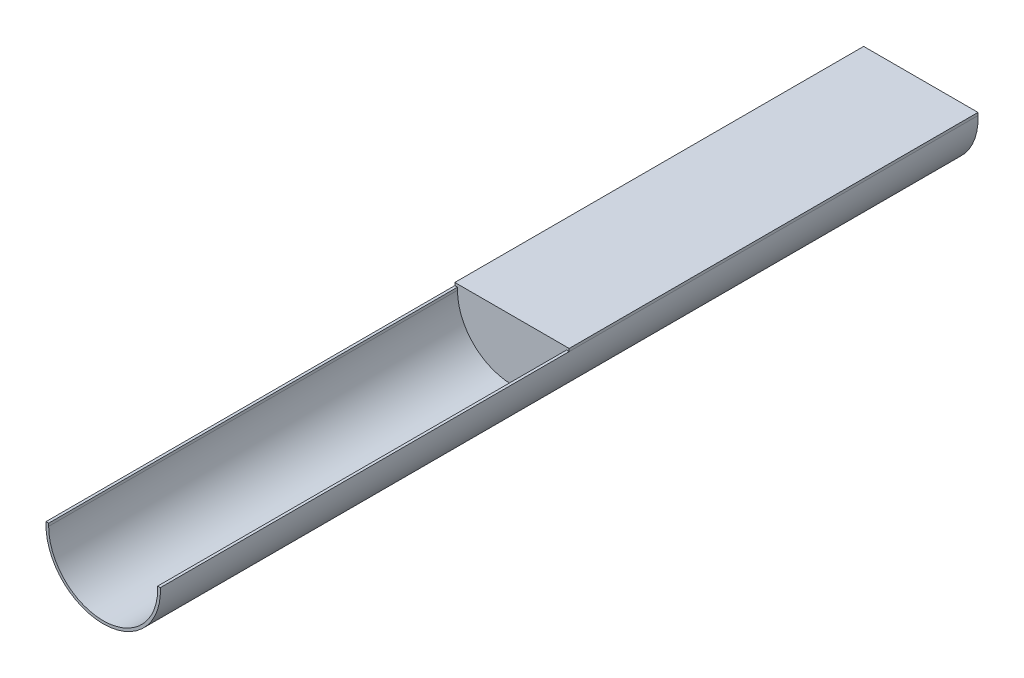
ISO-10303-21;
HEADER;
FILE_DESCRIPTION(('STEP AP214'),'2;1');
FILE_NAME('part.step','',(''),(''),'','','');
FILE_SCHEMA(('AUTOMOTIVE_DESIGN { 1 0 10303 214 1 1 1 1 }'));
ENDSEC;
DATA;
#1=APPLICATION_CONTEXT('core data for automotive mechanical design processes');
#2=APPLICATION_PROTOCOL_DEFINITION('international standard','automotive_design',2000,#1);
#3=PRODUCT_CONTEXT('',#1,'mechanical');
#4=PRODUCT('Part','Part','',(#3));
#5=PRODUCT_RELATED_PRODUCT_CATEGORY('part','',(#4));
#6=PRODUCT_DEFINITION_FORMATION('','',#4);
#7=PRODUCT_DEFINITION_CONTEXT('part definition',#1,'design');
#8=PRODUCT_DEFINITION('design','',#6,#7);
#9=PRODUCT_DEFINITION_SHAPE('','',#8);
#10=(LENGTH_UNIT() NAMED_UNIT(*) SI_UNIT(.MILLI.,.METRE.));
#11=(NAMED_UNIT(*) PLANE_ANGLE_UNIT() SI_UNIT($,.RADIAN.));
#12=(NAMED_UNIT(*) SI_UNIT($,.STERADIAN.) SOLID_ANGLE_UNIT());
#13=UNCERTAINTY_MEASURE_WITH_UNIT(LENGTH_MEASURE(1.E-05),#10,'distance_accuracy_value','');
#14=(GEOMETRIC_REPRESENTATION_CONTEXT(3) GLOBAL_UNCERTAINTY_ASSIGNED_CONTEXT((#13)) GLOBAL_UNIT_ASSIGNED_CONTEXT((#10,
#11,#12)) REPRESENTATION_CONTEXT('',''));
#15=CARTESIAN_POINT('',(0.,0.,0.));
#16=DIRECTION('',(0.,0.,1.));
#17=DIRECTION('',(1.,0.,0.));
#18=AXIS2_PLACEMENT_3D('',#15,#16,#17);
#19=CARTESIAN_POINT('',(40.,0.,600.));
#20=DIRECTION('',(1.,0.,0.));
#21=DIRECTION('',(0.,0.,-1.));
#22=AXIS2_PLACEMENT_3D('',#19,#20,#21);
#23=PLANE('',#22);
#24=DIRECTION('',(0.,1.,0.));
#25=VECTOR('',#24,1.);
#26=CARTESIAN_POINT('',(40.,0.,300.));
#27=LINE('',#26,#25);
#28=CARTESIAN_POINT('',(40.,0.,300.));
#29=VERTEX_POINT('',#28);
#30=CARTESIAN_POINT('',(40.,2.,300.));
#31=VERTEX_POINT('',#30);
#32=EDGE_CURVE('E218',#29,#31,#27,.T.);
#33=ORIENTED_EDGE('',*,*,#32,.F.);
#34=DIRECTION('',(0.,0.,-1.));
#35=VECTOR('',#34,1.);
#36=CARTESIAN_POINT('',(40.,0.,600.));
#37=LINE('',#36,#35);
#38=CARTESIAN_POINT('',(40.,0.,600.));
#39=VERTEX_POINT('',#38);
#40=EDGE_CURVE('E210',#39,#29,#37,.T.);
#41=ORIENTED_EDGE('',*,*,#40,.F.);
#42=DIRECTION('',(0.,-1.,0.));
#43=VECTOR('',#42,1.);
#44=CARTESIAN_POINT('',(40.,0.,600.));
#45=LINE('',#44,#43);
#46=CARTESIAN_POINT('',(40.,2.,600.));
#47=VERTEX_POINT('',#46);
#48=EDGE_CURVE('E191',#47,#39,#45,.T.);
#49=ORIENTED_EDGE('',*,*,#48,.F.);
#50=DIRECTION('',(0.,0.,-1.));
#51=VECTOR('',#50,1.);
#52=CARTESIAN_POINT('',(40.,2.,600.));
#53=LINE('',#52,#51);
#54=EDGE_CURVE('E41',#47,#31,#53,.T.);
#55=ORIENTED_EDGE('',*,*,#54,.T.);
#56=EDGE_LOOP('',(#33,#41,#49,#55));
#57=FACE_BOUND('',#56,.T.);
#58=ADVANCED_FACE('F33',(#57),#23,.F.);
#59=CARTESIAN_POINT('',(0.,0.,600.));
#60=DIRECTION('',(0.,0.,-1.));
#61=DIRECTION('',(-1.,0.,0.));
#62=AXIS2_PLACEMENT_3D('',#59,#60,#61);
#63=CYLINDRICAL_SURFACE('',#62,40.);
#64=CARTESIAN_POINT('',(0.,0.,300.));
#65=DIRECTION('',(0.,0.,-1.));
#66=DIRECTION('',(-1.,0.,0.));
#67=AXIS2_PLACEMENT_3D('',#64,#65,#66);
#68=CIRCLE('',#67,40.);
#69=CARTESIAN_POINT('',(-40.,0.,300.));
#70=VERTEX_POINT('',#69);
#71=EDGE_CURVE('E139',#70,#29,#68,.F.);
#72=ORIENTED_EDGE('',*,*,#71,.F.);
#73=DIRECTION('',(0.,0.,-1.));
#74=VECTOR('',#73,1.);
#75=CARTESIAN_POINT('',(-40.,0.,600.));
#76=LINE('',#75,#74);
#77=CARTESIAN_POINT('',(-40.,0.,600.));
#78=VERTEX_POINT('',#77);
#79=EDGE_CURVE('E135',#78,#70,#76,.T.);
#80=ORIENTED_EDGE('',*,*,#79,.F.);
#81=CARTESIAN_POINT('',(0.,0.,600.));
#82=DIRECTION('',(0.,0.,-1.));
#83=DIRECTION('',(1.,0.,0.));
#84=AXIS2_PLACEMENT_3D('',#81,#82,#83);
#85=CIRCLE('',#84,40.);
#86=EDGE_CURVE('E193',#39,#78,#85,.T.);
#87=ORIENTED_EDGE('',*,*,#86,.F.);
#88=ORIENTED_EDGE('',*,*,#40,.T.);
#89=EDGE_LOOP('',(#72,#80,#87,#88));
#90=FACE_BOUND('',#89,.T.);
#91=ADVANCED_FACE('F274',(#90),#63,.F.);
#92=CARTESIAN_POINT('',(-40.,0.,600.));
#93=DIRECTION('',(-1.,0.,0.));
#94=DIRECTION('',(0.,0.,1.));
#95=AXIS2_PLACEMENT_3D('',#92,#93,#94);
#96=PLANE('',#95);
#97=DIRECTION('',(0.,-1.,0.));
#98=VECTOR('',#97,1.);
#99=CARTESIAN_POINT('',(-40.,0.,300.));
#100=LINE('',#99,#98);
#101=CARTESIAN_POINT('',(-40.,2.,300.));
#102=VERTEX_POINT('',#101);
#103=EDGE_CURVE('E128',#102,#70,#100,.T.);
#104=ORIENTED_EDGE('',*,*,#103,.F.);
#105=DIRECTION('',(0.,0.,-1.));
#106=VECTOR('',#105,1.);
#107=CARTESIAN_POINT('',(-40.,2.,600.));
#108=LINE('',#107,#106);
#109=CARTESIAN_POINT('',(-40.,2.,600.));
#110=VERTEX_POINT('',#109);
#111=EDGE_CURVE('E132',#110,#102,#108,.T.);
#112=ORIENTED_EDGE('',*,*,#111,.F.);
#113=DIRECTION('',(0.,1.,0.));
#114=VECTOR('',#113,1.);
#115=CARTESIAN_POINT('',(-40.,0.,600.));
#116=LINE('',#115,#114);
#117=EDGE_CURVE('E195',#78,#110,#116,.T.);
#118=ORIENTED_EDGE('',*,*,#117,.F.);
#119=ORIENTED_EDGE('',*,*,#79,.T.);
#120=EDGE_LOOP('',(#104,#112,#118,#119));
#121=FACE_BOUND('',#120,.T.);
#122=ADVANCED_FACE('F130',(#121),#96,.F.);
#123=CARTESIAN_POINT('',(41.9523539268061,2.,600.));
#124=DIRECTION('',(0.,-1.,0.));
#125=DIRECTION('',(0.,0.,-1.));
#126=AXIS2_PLACEMENT_3D('',#123,#124,#125);
#127=PLANE('',#126);
#128=DIRECTION('',(1.,0.,0.));
#129=VECTOR('',#128,1.);
#130=CARTESIAN_POINT('',(-41.952353926806,2.,300.));
#131=LINE('',#130,#129);
#132=CARTESIAN_POINT('',(41.9523539268061,2.,300.));
#133=VERTEX_POINT('',#132);
#134=EDGE_CURVE('E156',#31,#133,#131,.T.);
#135=ORIENTED_EDGE('',*,*,#134,.F.);
#136=ORIENTED_EDGE('',*,*,#54,.F.);
#137=DIRECTION('',(-1.,0.,0.));
#138=VECTOR('',#137,1.);
#139=CARTESIAN_POINT('',(41.9523539268061,2.,600.));
#140=LINE('',#139,#138);
#141=CARTESIAN_POINT('',(41.9523539268061,2.,600.));
#142=VERTEX_POINT('',#141);
#143=EDGE_CURVE('E188',#142,#47,#140,.T.);
#144=ORIENTED_EDGE('',*,*,#143,.F.);
#145=DIRECTION('',(0.,0.,-1.));
#146=VECTOR('',#145,1.);
#147=CARTESIAN_POINT('',(41.9523539268061,2.,600.));
#148=LINE('',#147,#146);
#149=EDGE_CURVE('E11',#142,#133,#148,.T.);
#150=ORIENTED_EDGE('',*,*,#149,.T.);
#151=EDGE_LOOP('',(#135,#136,#144,#150));
#152=FACE_BOUND('',#151,.T.);
#153=ADVANCED_FACE('F221',(#152),#127,.F.);
#154=CARTESIAN_POINT('',(-40.,2.,600.));
#155=DIRECTION('',(0.,-1.,0.));
#156=DIRECTION('',(0.,0.,-1.));
#157=AXIS2_PLACEMENT_3D('',#154,#155,#156);
#158=PLANE('',#157);
#159=CARTESIAN_POINT('',(-41.9523539268061,2.,300.));
#160=VERTEX_POINT('',#159);
#161=EDGE_CURVE('E146',#160,#102,#131,.T.);
#162=ORIENTED_EDGE('',*,*,#161,.F.);
#163=DIRECTION('',(0.,0.,-1.));
#164=VECTOR('',#163,1.);
#165=CARTESIAN_POINT('',(-41.9523539268061,2.,600.));
#166=LINE('',#165,#164);
#167=CARTESIAN_POINT('',(-41.9523539268061,2.,600.));
#168=VERTEX_POINT('',#167);
#169=EDGE_CURVE('E150',#168,#160,#166,.T.);
#170=ORIENTED_EDGE('',*,*,#169,.F.);
#171=DIRECTION('',(-1.,0.,0.));
#172=VECTOR('',#171,1.);
#173=CARTESIAN_POINT('',(-40.,2.,600.));
#174=LINE('',#173,#172);
#175=EDGE_CURVE('E148',#110,#168,#174,.T.);
#176=ORIENTED_EDGE('',*,*,#175,.F.);
#177=ORIENTED_EDGE('',*,*,#111,.T.);
#178=EDGE_LOOP('',(#162,#170,#176,#177));
#179=FACE_BOUND('',#178,.T.);
#180=ADVANCED_FACE('F144',(#179),#158,.F.);
#181=CARTESIAN_POINT('',(0.,0.,600.));
#182=DIRECTION('',(0.,0.,-1.));
#183=DIRECTION('',(-1.,0.,0.));
#184=AXIS2_PLACEMENT_3D('',#181,#182,#183);
#185=CYLINDRICAL_SURFACE('',#184,42.);
#186=CARTESIAN_POINT('',(0.,0.,0.));
#187=DIRECTION('',(0.,0.,1.));
#188=DIRECTION('',(1.,0.,0.));
#189=AXIS2_PLACEMENT_3D('',#186,#187,#188);
#190=CIRCLE('',#189,42.);
#191=CARTESIAN_POINT('',(-41.9523539268061,2.,0.));
#192=VERTEX_POINT('',#191);
#193=CARTESIAN_POINT('',(41.9523539268061,2.,0.));
#194=VERTEX_POINT('',#193);
#195=EDGE_CURVE('E184',#192,#194,#190,.T.);
#196=ORIENTED_EDGE('',*,*,#195,.T.);
#197=DIRECTION('',(0.,0.,-1.));
#198=VECTOR('',#197,1.);
#199=CARTESIAN_POINT('',(41.9523539268061,2.,0.));
#200=LINE('',#199,#198);
#201=EDGE_CURVE('E56',#133,#194,#200,.T.);
#202=ORIENTED_EDGE('',*,*,#201,.F.);
#203=ORIENTED_EDGE('',*,*,#149,.F.);
#204=CARTESIAN_POINT('',(0.,0.,600.));
#205=DIRECTION('',(0.,0.,1.));
#206=DIRECTION('',(1.,0.,0.));
#207=AXIS2_PLACEMENT_3D('',#204,#205,#206);
#208=CIRCLE('',#207,42.);
#209=EDGE_CURVE('E185',#168,#142,#208,.T.);
#210=ORIENTED_EDGE('',*,*,#209,.F.);
#211=ORIENTED_EDGE('',*,*,#169,.T.);
#212=DIRECTION('',(0.,0.,1.));
#213=VECTOR('',#212,1.);
#214=CARTESIAN_POINT('',(-41.9523539268061,2.,0.));
#215=LINE('',#214,#213);
#216=EDGE_CURVE('E161',#192,#160,#215,.T.);
#217=ORIENTED_EDGE('',*,*,#216,.F.);
#218=EDGE_LOOP('',(#196,#202,#203,#210,#211,#217));
#219=FACE_BOUND('',#218,.T.);
#220=ADVANCED_FACE('F35',(#219),#185,.T.);
#221=CARTESIAN_POINT('',(40.,0.,298.));
#222=VERTEX_POINT('',#221);
#223=CARTESIAN_POINT('',(40.,0.,0.));
#224=VERTEX_POINT('',#223);
#225=EDGE_CURVE('E209',#222,#224,#37,.T.);
#226=ORIENTED_EDGE('',*,*,#225,.F.);
#227=DIRECTION('',(0.,1.,0.));
#228=VECTOR('',#227,1.);
#229=CARTESIAN_POINT('',(40.,0.,298.));
#230=LINE('',#229,#228);
#231=CARTESIAN_POINT('',(40.,2.,298.));
#232=VERTEX_POINT('',#231);
#233=EDGE_CURVE('E236',#222,#232,#230,.T.);
#234=ORIENTED_EDGE('',*,*,#233,.T.);
#235=DIRECTION('',(0.,0.,1.));
#236=VECTOR('',#235,1.);
#237=CARTESIAN_POINT('',(40.,2.,600.));
#238=LINE('',#237,#236);
#239=CARTESIAN_POINT('',(40.,2.,0.));
#240=VERTEX_POINT('',#239);
#241=EDGE_CURVE('E181',#240,#232,#238,.T.);
#242=ORIENTED_EDGE('',*,*,#241,.F.);
#243=DIRECTION('',(0.,-1.,0.));
#244=VECTOR('',#243,1.);
#245=CARTESIAN_POINT('',(40.,0.,0.));
#246=LINE('',#245,#244);
#247=EDGE_CURVE('E199',#240,#224,#246,.T.);
#248=ORIENTED_EDGE('',*,*,#247,.T.);
#249=EDGE_LOOP('',(#226,#234,#242,#248));
#250=FACE_BOUND('',#249,.T.);
#251=ADVANCED_FACE('F251',(#250),#23,.F.);
#252=CARTESIAN_POINT('',(-40.,0.,298.));
#253=VERTEX_POINT('',#252);
#254=CARTESIAN_POINT('',(-40.,0.,0.));
#255=VERTEX_POINT('',#254);
#256=EDGE_CURVE('E149',#253,#255,#76,.T.);
#257=ORIENTED_EDGE('',*,*,#256,.F.);
#258=CARTESIAN_POINT('',(0.,0.,298.));
#259=DIRECTION('',(0.,0.,-1.));
#260=DIRECTION('',(-1.,0.,0.));
#261=AXIS2_PLACEMENT_3D('',#258,#259,#260);
#262=CIRCLE('',#261,40.);
#263=EDGE_CURVE('E239',#253,#222,#262,.F.);
#264=ORIENTED_EDGE('',*,*,#263,.T.);
#265=ORIENTED_EDGE('',*,*,#225,.T.);
#266=CARTESIAN_POINT('',(0.,0.,0.));
#267=DIRECTION('',(0.,0.,-1.));
#268=DIRECTION('',(1.,0.,0.));
#269=AXIS2_PLACEMENT_3D('',#266,#267,#268);
#270=CIRCLE('',#269,40.);
#271=EDGE_CURVE('E202',#224,#255,#270,.T.);
#272=ORIENTED_EDGE('',*,*,#271,.T.);
#273=EDGE_LOOP('',(#257,#264,#265,#272));
#274=FACE_BOUND('',#273,.T.);
#275=ADVANCED_FACE('F261',(#274),#63,.F.);
#276=DIRECTION('',(0.,0.,-1.));
#277=VECTOR('',#276,1.);
#278=CARTESIAN_POINT('',(-40.,2.,600.));
#279=LINE('',#278,#277);
#280=CARTESIAN_POINT('',(-40.,2.,298.));
#281=VERTEX_POINT('',#280);
#282=CARTESIAN_POINT('',(-40.,2.,0.));
#283=VERTEX_POINT('',#282);
#284=EDGE_CURVE('E179',#281,#283,#279,.T.);
#285=ORIENTED_EDGE('',*,*,#284,.F.);
#286=DIRECTION('',(0.,-1.,0.));
#287=VECTOR('',#286,1.);
#288=CARTESIAN_POINT('',(-40.,0.,298.));
#289=LINE('',#288,#287);
#290=EDGE_CURVE('E48',#281,#253,#289,.T.);
#291=ORIENTED_EDGE('',*,*,#290,.T.);
#292=ORIENTED_EDGE('',*,*,#256,.T.);
#293=DIRECTION('',(0.,1.,0.));
#294=VECTOR('',#293,1.);
#295=CARTESIAN_POINT('',(-40.,0.,0.));
#296=LINE('',#295,#294);
#297=EDGE_CURVE('E189',#255,#283,#296,.T.);
#298=ORIENTED_EDGE('',*,*,#297,.T.);
#299=EDGE_LOOP('',(#285,#291,#292,#298));
#300=FACE_BOUND('',#299,.T.);
#301=ADVANCED_FACE('F263',(#300),#96,.F.);
#302=CARTESIAN_POINT('',(0.,0.,600.));
#303=DIRECTION('',(0.,0.,1.));
#304=DIRECTION('',(1.,0.,0.));
#305=AXIS2_PLACEMENT_3D('',#302,#303,#304);
#306=PLANE('',#305);
#307=ORIENTED_EDGE('',*,*,#209,.T.);
#308=ORIENTED_EDGE('',*,*,#143,.T.);
#309=ORIENTED_EDGE('',*,*,#48,.T.);
#310=ORIENTED_EDGE('',*,*,#86,.T.);
#311=ORIENTED_EDGE('',*,*,#117,.T.);
#312=ORIENTED_EDGE('',*,*,#175,.T.);
#313=EDGE_LOOP('',(#307,#308,#309,#310,#311,#312));
#314=FACE_BOUND('',#313,.T.);
#315=ADVANCED_FACE('F265',(#314),#306,.T.);
#316=CARTESIAN_POINT('',(0.,0.,0.));
#317=DIRECTION('',(0.,0.,1.));
#318=DIRECTION('',(1.,0.,0.));
#319=AXIS2_PLACEMENT_3D('',#316,#317,#318);
#320=PLANE('',#319);
#321=ORIENTED_EDGE('',*,*,#247,.F.);
#322=DIRECTION('',(-1.,0.,0.));
#323=VECTOR('',#322,1.);
#324=CARTESIAN_POINT('',(-41.9523539268061,2.,0.));
#325=LINE('',#324,#323);
#326=EDGE_CURVE('E158',#240,#283,#325,.T.);
#327=ORIENTED_EDGE('',*,*,#326,.T.);
#328=ORIENTED_EDGE('',*,*,#297,.F.);
#329=ORIENTED_EDGE('',*,*,#271,.F.);
#330=EDGE_LOOP('',(#321,#327,#328,#329));
#331=FACE_BOUND('',#330,.T.);
#332=ORIENTED_EDGE('',*,*,#195,.F.);
#333=DIRECTION('',(0.,-1.,0.));
#334=VECTOR('',#333,1.);
#335=CARTESIAN_POINT('',(-41.9523539268061,4.,0.));
#336=LINE('',#335,#334);
#337=CARTESIAN_POINT('',(-41.9523539268061,4.,0.));
#338=VERTEX_POINT('',#337);
#339=EDGE_CURVE('E168',#338,#192,#336,.T.);
#340=ORIENTED_EDGE('',*,*,#339,.F.);
#341=DIRECTION('',(-1.,0.,0.));
#342=VECTOR('',#341,1.);
#343=CARTESIAN_POINT('',(-41.9523539268061,4.,0.));
#344=LINE('',#343,#342);
#345=CARTESIAN_POINT('',(41.9523539268061,4.,0.));
#346=VERTEX_POINT('',#345);
#347=EDGE_CURVE('E172',#346,#338,#344,.T.);
#348=ORIENTED_EDGE('',*,*,#347,.F.);
#349=DIRECTION('',(0.,-1.,0.));
#350=VECTOR('',#349,1.);
#351=CARTESIAN_POINT('',(41.9523539268061,4.,0.));
#352=LINE('',#351,#350);
#353=EDGE_CURVE('E171',#346,#194,#352,.T.);
#354=ORIENTED_EDGE('',*,*,#353,.T.);
#355=EDGE_LOOP('',(#332,#340,#348,#354));
#356=FACE_BOUND('',#355,.T.);
#357=ADVANCED_FACE('F256',(#331,#356),#320,.F.);
#358=CARTESIAN_POINT('',(0.,2.,0.));
#359=DIRECTION('',(0.,1.,0.));
#360=DIRECTION('',(0.,0.,1.));
#361=AXIS2_PLACEMENT_3D('',#358,#359,#360);
#362=PLANE('',#361);
#363=ORIENTED_EDGE('',*,*,#241,.T.);
#364=DIRECTION('',(1.,0.,0.));
#365=VECTOR('',#364,1.);
#366=CARTESIAN_POINT('',(-41.9523539268061,2.,298.));
#367=LINE('',#366,#365);
#368=EDGE_CURVE('E140',#281,#232,#367,.T.);
#369=ORIENTED_EDGE('',*,*,#368,.F.);
#370=ORIENTED_EDGE('',*,*,#284,.T.);
#371=ORIENTED_EDGE('',*,*,#326,.F.);
#372=EDGE_LOOP('',(#363,#369,#370,#371));
#373=FACE_BOUND('',#372,.T.);
#374=ADVANCED_FACE('F253',(#373),#362,.F.);
#375=CARTESIAN_POINT('',(-41.9523539268061,4.,0.));
#376=DIRECTION('',(1.,0.,0.));
#377=DIRECTION('',(0.,0.,-1.));
#378=AXIS2_PLACEMENT_3D('',#375,#376,#377);
#379=PLANE('',#378);
#380=ORIENTED_EDGE('',*,*,#216,.T.);
#381=DIRECTION('',(0.,-1.,0.));
#382=VECTOR('',#381,1.);
#383=CARTESIAN_POINT('',(-41.952353926806,4.,300.));
#384=LINE('',#383,#382);
#385=CARTESIAN_POINT('',(-41.952353926806,4.,300.));
#386=VERTEX_POINT('',#385);
#387=EDGE_CURVE('E155',#386,#160,#384,.T.);
#388=ORIENTED_EDGE('',*,*,#387,.F.);
#389=DIRECTION('',(0.,0.,1.));
#390=VECTOR('',#389,1.);
#391=CARTESIAN_POINT('',(-41.9523539268061,4.,0.));
#392=LINE('',#391,#390);
#393=EDGE_CURVE('E167',#338,#386,#392,.T.);
#394=ORIENTED_EDGE('',*,*,#393,.F.);
#395=ORIENTED_EDGE('',*,*,#339,.T.);
#396=EDGE_LOOP('',(#380,#388,#394,#395));
#397=FACE_BOUND('',#396,.T.);
#398=ADVANCED_FACE('F295',(#397),#379,.F.);
#399=CARTESIAN_POINT('',(-41.952353926806,4.,300.));
#400=DIRECTION('',(0.,0.,-1.));
#401=DIRECTION('',(-1.,0.,0.));
#402=AXIS2_PLACEMENT_3D('',#399,#400,#401);
#403=PLANE('',#402);
#404=ORIENTED_EDGE('',*,*,#161,.T.);
#405=ORIENTED_EDGE('',*,*,#103,.T.);
#406=ORIENTED_EDGE('',*,*,#71,.T.);
#407=ORIENTED_EDGE('',*,*,#32,.T.);
#408=ORIENTED_EDGE('',*,*,#134,.T.);
#409=DIRECTION('',(0.,-1.,0.));
#410=VECTOR('',#409,1.);
#411=CARTESIAN_POINT('',(41.9523539268061,4.,300.));
#412=LINE('',#411,#410);
#413=CARTESIAN_POINT('',(41.9523539268061,4.,300.));
#414=VERTEX_POINT('',#413);
#415=EDGE_CURVE('E175',#414,#133,#412,.T.);
#416=ORIENTED_EDGE('',*,*,#415,.F.);
#417=DIRECTION('',(1.,0.,0.));
#418=VECTOR('',#417,1.);
#419=CARTESIAN_POINT('',(-41.952353926806,4.,300.));
#420=LINE('',#419,#418);
#421=EDGE_CURVE('E230',#386,#414,#420,.T.);
#422=ORIENTED_EDGE('',*,*,#421,.F.);
#423=ORIENTED_EDGE('',*,*,#387,.T.);
#424=EDGE_LOOP('',(#404,#405,#406,#407,#408,#416,#422,#423));
#425=FACE_BOUND('',#424,.T.);
#426=ADVANCED_FACE('F153',(#425),#403,.F.);
#427=CARTESIAN_POINT('',(41.9523539268061,4.,0.));
#428=DIRECTION('',(-1.,0.,0.));
#429=DIRECTION('',(0.,0.,1.));
#430=AXIS2_PLACEMENT_3D('',#427,#428,#429);
#431=PLANE('',#430);
#432=ORIENTED_EDGE('',*,*,#201,.T.);
#433=ORIENTED_EDGE('',*,*,#353,.F.);
#434=DIRECTION('',(0.,0.,-1.));
#435=VECTOR('',#434,1.);
#436=CARTESIAN_POINT('',(41.9523539268061,4.,0.));
#437=LINE('',#436,#435);
#438=EDGE_CURVE('E227',#414,#346,#437,.T.);
#439=ORIENTED_EDGE('',*,*,#438,.F.);
#440=ORIENTED_EDGE('',*,*,#415,.T.);
#441=EDGE_LOOP('',(#432,#433,#439,#440));
#442=FACE_BOUND('',#441,.T.);
#443=ADVANCED_FACE('F225',(#442),#431,.F.);
#444=CARTESIAN_POINT('',(0.,4.,0.));
#445=DIRECTION('',(0.,1.,0.));
#446=DIRECTION('',(0.,0.,1.));
#447=AXIS2_PLACEMENT_3D('',#444,#445,#446);
#448=PLANE('',#447);
#449=ORIENTED_EDGE('',*,*,#393,.T.);
#450=ORIENTED_EDGE('',*,*,#421,.T.);
#451=ORIENTED_EDGE('',*,*,#438,.T.);
#452=ORIENTED_EDGE('',*,*,#347,.T.);
#453=EDGE_LOOP('',(#449,#450,#451,#452));
#454=FACE_BOUND('',#453,.T.);
#455=ADVANCED_FACE('F293',(#454),#448,.T.);
#456=CARTESIAN_POINT('',(0.,0.,298.));
#457=DIRECTION('',(0.,0.,-1.));
#458=DIRECTION('',(-1.,0.,0.));
#459=AXIS2_PLACEMENT_3D('',#456,#457,#458);
#460=PLANE('',#459);
#461=ORIENTED_EDGE('',*,*,#233,.F.);
#462=ORIENTED_EDGE('',*,*,#263,.F.);
#463=ORIENTED_EDGE('',*,*,#290,.F.);
#464=ORIENTED_EDGE('',*,*,#368,.T.);
#465=EDGE_LOOP('',(#461,#462,#463,#464));
#466=FACE_BOUND('',#465,.T.);
#467=ADVANCED_FACE('F245',(#466),#460,.T.);
#468=CLOSED_SHELL('',(#58,#91,#122,#153,#180,#220,#251,#275,#301,#315,#357,#374,#398,#426,#443,
#455,#467));
#469=MANIFOLD_SOLID_BREP('B2',#468);
#470=ADVANCED_BREP_SHAPE_REPRESENTATION('',(#18,#469),#14);
#471=SHAPE_DEFINITION_REPRESENTATION(#9,#470);
ENDSEC;
END-ISO-10303-21;
